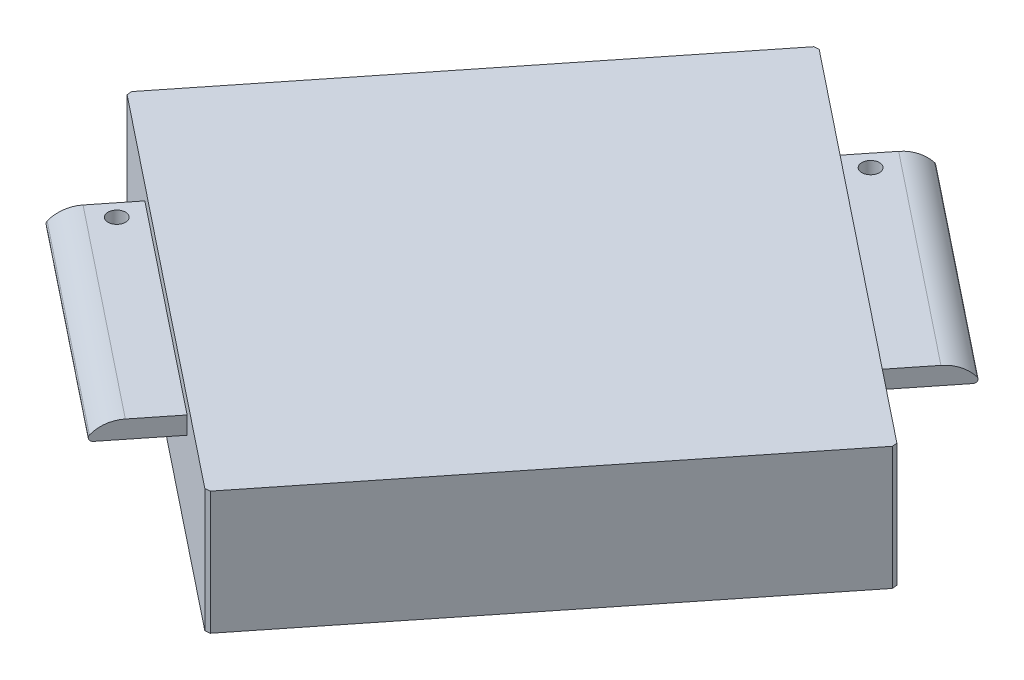
ISO-10303-21;
HEADER;
FILE_DESCRIPTION(('STEP AP214'),'2;1');
FILE_NAME('part.step','',(''),(''),'','','');
FILE_SCHEMA(('AUTOMOTIVE_DESIGN { 1 0 10303 214 1 1 1 1 }'));
ENDSEC;
DATA;
#1=APPLICATION_CONTEXT('core data for automotive mechanical design processes');
#2=APPLICATION_PROTOCOL_DEFINITION('international standard','automotive_design',2000,#1);
#3=PRODUCT_CONTEXT('',#1,'mechanical');
#4=PRODUCT('Part','Part','',(#3));
#5=PRODUCT_RELATED_PRODUCT_CATEGORY('part','',(#4));
#6=PRODUCT_DEFINITION_FORMATION('','',#4);
#7=PRODUCT_DEFINITION_CONTEXT('part definition',#1,'design');
#8=PRODUCT_DEFINITION('design','',#6,#7);
#9=PRODUCT_DEFINITION_SHAPE('','',#8);
#10=(LENGTH_UNIT() NAMED_UNIT(*) SI_UNIT(.MILLI.,.METRE.));
#11=(NAMED_UNIT(*) PLANE_ANGLE_UNIT() SI_UNIT($,.RADIAN.));
#12=(NAMED_UNIT(*) SI_UNIT($,.STERADIAN.) SOLID_ANGLE_UNIT());
#13=UNCERTAINTY_MEASURE_WITH_UNIT(LENGTH_MEASURE(1.E-05),#10,'distance_accuracy_value','');
#14=(GEOMETRIC_REPRESENTATION_CONTEXT(3) GLOBAL_UNCERTAINTY_ASSIGNED_CONTEXT((#13)) GLOBAL_UNIT_ASSIGNED_CONTEXT((#10,
#11,#12)) REPRESENTATION_CONTEXT('',''));
#15=CARTESIAN_POINT('',(0.,0.,0.));
#16=DIRECTION('',(0.,0.,1.));
#17=DIRECTION('',(1.,0.,0.));
#18=AXIS2_PLACEMENT_3D('',#15,#16,#17);
#19=CARTESIAN_POINT('',(370.197746484565,940.,-1308.88992049536));
#20=DIRECTION('',(0.62251463663762,0.,-0.782608156852414));
#21=DIRECTION('',(-0.782608156852414,0.,-0.62251463663762));
#22=AXIS2_PLACEMENT_3D('',#19,#20,#21);
#23=PLANE('',#22);
#24=DIRECTION('',(0.782608156852414,0.,0.62251463663762));
#25=VECTOR('',#24,1.);
#26=CARTESIAN_POINT('',(370.197746484565,870.,-1308.88992049536));
#27=LINE('',#26,#25);
#28=CARTESIAN_POINT('',(370.197746484565,870.,-1308.88992049536));
#29=VERTEX_POINT('',#28);
#30=CARTESIAN_POINT('',(586.197597775831,870.,-1137.07588078337));
#31=VERTEX_POINT('',#30);
#32=EDGE_CURVE('E235',#29,#31,#27,.T.);
#33=ORIENTED_EDGE('',*,*,#32,.F.);
#34=DIRECTION('',(0.,-1.,0.));
#35=VECTOR('',#34,1.);
#36=CARTESIAN_POINT('',(370.197746484565,940.,-1308.88992049536));
#37=LINE('',#36,#35);
#38=CARTESIAN_POINT('',(370.197746484565,940.,-1308.88992049536));
#39=VERTEX_POINT('',#38);
#40=EDGE_CURVE('E11',#39,#29,#37,.T.);
#41=ORIENTED_EDGE('',*,*,#40,.F.);
#42=DIRECTION('',(0.782608156852414,0.,0.62251463663762));
#43=VECTOR('',#42,1.);
#44=CARTESIAN_POINT('',(370.197746484565,940.,-1308.88992049536));
#45=LINE('',#44,#43);
#46=CARTESIAN_POINT('',(586.197597775831,940.,-1137.07588078337));
#47=VERTEX_POINT('',#46);
#48=EDGE_CURVE('E259',#39,#47,#45,.T.);
#49=ORIENTED_EDGE('',*,*,#48,.T.);
#50=DIRECTION('',(0.,-1.,0.));
#51=VECTOR('',#50,1.);
#52=CARTESIAN_POINT('',(586.197597775831,940.,-1137.07588078337));
#53=LINE('',#52,#51);
#54=EDGE_CURVE('E25',#47,#31,#53,.T.);
#55=ORIENTED_EDGE('',*,*,#54,.T.);
#56=EDGE_LOOP('',(#33,#41,#49,#55));
#57=FACE_BOUND('',#56,.T.);
#58=DIRECTION('',(0.782608156852414,0.,0.62251463663762));
#59=VECTOR('',#58,1.);
#60=CARTESIAN_POINT('',(419.502060366267,932.,-1269.67149838719));
#61=LINE('',#60,#59);
#62=CARTESIAN_POINT('',(419.502060366267,932.,-1269.67149838719));
#63=VERTEX_POINT('',#62);
#64=CARTESIAN_POINT('',(536.893283894128,932.,-1176.29430289154));
#65=VERTEX_POINT('',#64);
#66=EDGE_CURVE('E32',#63,#65,#61,.T.);
#67=ORIENTED_EDGE('',*,*,#66,.F.);
#68=DIRECTION('',(0.,-1.,0.));
#69=VECTOR('',#68,1.);
#70=CARTESIAN_POINT('',(419.502060366267,932.,-1269.67149838719));
#71=LINE('',#70,#69);
#72=CARTESIAN_POINT('',(419.502060366267,922.,-1269.67149838719));
#73=VERTEX_POINT('',#72);
#74=EDGE_CURVE('E36',#63,#73,#71,.T.);
#75=ORIENTED_EDGE('',*,*,#74,.T.);
#76=DIRECTION('',(0.782608156852414,0.,0.62251463663762));
#77=VECTOR('',#76,1.);
#78=CARTESIAN_POINT('',(419.502060366267,922.,-1269.67149838719));
#79=LINE('',#78,#77);
#80=CARTESIAN_POINT('',(536.893283894128,922.,-1176.29430289154));
#81=VERTEX_POINT('',#80);
#82=EDGE_CURVE('E136',#73,#81,#79,.T.);
#83=ORIENTED_EDGE('',*,*,#82,.T.);
#84=DIRECTION('',(0.,-1.,0.));
#85=VECTOR('',#84,1.);
#86=CARTESIAN_POINT('',(536.893283894128,932.,-1176.29430289154));
#87=LINE('',#86,#85);
#88=EDGE_CURVE('E139',#65,#81,#87,.T.);
#89=ORIENTED_EDGE('',*,*,#88,.F.);
#90=EDGE_LOOP('',(#67,#75,#83,#89));
#91=FACE_BOUND('',#90,.T.);
#92=ADVANCED_FACE('F17',(#57,#91),#23,.T.);
#93=CARTESIAN_POINT('',(367.387500897584,940.,-1308.56973345493));
#94=DIRECTION('',(-0.113203213767907,0.,-0.993571855676588));
#95=DIRECTION('',(-0.993571855676588,0.,0.113203213767907));
#96=AXIS2_PLACEMENT_3D('',#93,#94,#95);
#97=PLANE('',#96);
#98=DIRECTION('',(0.993571855676588,0.,-0.113203213767907));
#99=VECTOR('',#98,1.);
#100=CARTESIAN_POINT('',(367.387500897584,870.,-1308.56973345493));
#101=LINE('',#100,#99);
#102=CARTESIAN_POINT('',(367.387500897584,870.,-1308.56973345493));
#103=VERTEX_POINT('',#102);
#104=EDGE_CURVE('E232',#103,#29,#101,.T.);
#105=ORIENTED_EDGE('',*,*,#104,.F.);
#106=DIRECTION('',(0.,-1.,0.));
#107=VECTOR('',#106,1.);
#108=CARTESIAN_POINT('',(367.387500897584,940.,-1308.56973345493));
#109=LINE('',#108,#107);
#110=CARTESIAN_POINT('',(367.387500897584,940.,-1308.56973345493));
#111=VERTEX_POINT('',#110);
#112=EDGE_CURVE('E280',#111,#103,#109,.T.);
#113=ORIENTED_EDGE('',*,*,#112,.F.);
#114=DIRECTION('',(0.993571855676588,0.,-0.113203213767907));
#115=VECTOR('',#114,1.);
#116=CARTESIAN_POINT('',(367.387500897584,940.,-1308.56973345493));
#117=LINE('',#116,#115);
#118=EDGE_CURVE('E256',#111,#39,#117,.T.);
#119=ORIENTED_EDGE('',*,*,#118,.T.);
#120=ORIENTED_EDGE('',*,*,#40,.T.);
#121=EDGE_LOOP('',(#105,#113,#119,#120));
#122=FACE_BOUND('',#121,.T.);
#123=ADVANCED_FACE('F19',(#122),#97,.T.);
#124=CARTESIAN_POINT('',(586.197597775831,940.,-1137.07588078337));
#125=DIRECTION('',(0.993571855676588,0.,-0.113203213767907));
#126=DIRECTION('',(-0.113203213767907,0.,-0.993571855676588));
#127=AXIS2_PLACEMENT_3D('',#124,#125,#126);
#128=PLANE('',#127);
#129=DIRECTION('',(0.113203213767907,0.,0.993571855676587));
#130=VECTOR('',#129,1.);
#131=CARTESIAN_POINT('',(586.197597775831,870.,-1137.07588078337));
#132=LINE('',#131,#130);
#133=CARTESIAN_POINT('',(586.51778481626,870.,-1134.26563519639));
#134=VERTEX_POINT('',#133);
#135=EDGE_CURVE('E238',#31,#134,#132,.T.);
#136=ORIENTED_EDGE('',*,*,#135,.F.);
#137=ORIENTED_EDGE('',*,*,#54,.F.);
#138=DIRECTION('',(0.113203213767907,0.,0.993571855676587));
#139=VECTOR('',#138,1.);
#140=CARTESIAN_POINT('',(586.197597775831,940.,-1137.07588078337));
#141=LINE('',#140,#139);
#142=CARTESIAN_POINT('',(586.51778481626,940.,-1134.26563519639));
#143=VERTEX_POINT('',#142);
#144=EDGE_CURVE('E262',#47,#143,#141,.T.);
#145=ORIENTED_EDGE('',*,*,#144,.T.);
#146=DIRECTION('',(0.,-1.,0.));
#147=VECTOR('',#146,1.);
#148=CARTESIAN_POINT('',(586.51778481626,940.,-1134.26563519639));
#149=LINE('',#148,#147);
#150=EDGE_CURVE('E292',#143,#134,#149,.T.);
#151=ORIENTED_EDGE('',*,*,#150,.T.);
#152=EDGE_LOOP('',(#136,#137,#145,#151));
#153=FACE_BOUND('',#152,.T.);
#154=ADVANCED_FACE('F299',(#153),#128,.T.);
#155=CARTESIAN_POINT('',(586.51778481626,940.,-1134.26563519639));
#156=DIRECTION('',(0.782608156852414,0.,0.62251463663762));
#157=DIRECTION('',(0.62251463663762,0.,-0.782608156852414));
#158=AXIS2_PLACEMENT_3D('',#155,#156,#157);
#159=PLANE('',#158);
#160=DIRECTION('',(-0.62251463663762,0.,0.782608156852414));
#161=VECTOR('',#160,1.);
#162=CARTESIAN_POINT('',(586.51778481626,870.,-1134.26563519639));
#163=LINE('',#162,#161);
#164=CARTESIAN_POINT('',(414.703745104277,870.,-918.265783905128));
#165=VERTEX_POINT('',#164);
#166=EDGE_CURVE('E241',#134,#165,#163,.T.);
#167=ORIENTED_EDGE('',*,*,#166,.F.);
#168=ORIENTED_EDGE('',*,*,#150,.F.);
#169=DIRECTION('',(-0.62251463663762,0.,0.782608156852414));
#170=VECTOR('',#169,1.);
#171=CARTESIAN_POINT('',(586.51778481626,940.,-1134.26563519639));
#172=LINE('',#171,#170);
#173=CARTESIAN_POINT('',(414.703745104277,940.,-918.265783905128));
#174=VERTEX_POINT('',#173);
#175=EDGE_CURVE('E265',#143,#174,#172,.T.);
#176=ORIENTED_EDGE('',*,*,#175,.T.);
#177=DIRECTION('',(0.,-1.,0.));
#178=VECTOR('',#177,1.);
#179=CARTESIAN_POINT('',(414.703745104277,940.,-918.265783905128));
#180=LINE('',#179,#178);
#181=EDGE_CURVE('E290',#174,#165,#180,.T.);
#182=ORIENTED_EDGE('',*,*,#181,.T.);
#183=EDGE_LOOP('',(#167,#168,#176,#182));
#184=FACE_BOUND('',#183,.T.);
#185=ADVANCED_FACE('F314',(#184),#159,.T.);
#186=CARTESIAN_POINT('',(414.703745104277,940.,-918.265783905128));
#187=DIRECTION('',(0.113203213767907,0.,0.993571855676588));
#188=DIRECTION('',(0.993571855676588,0.,-0.113203213767907));
#189=AXIS2_PLACEMENT_3D('',#186,#187,#188);
#190=PLANE('',#189);
#191=DIRECTION('',(-0.993571855676588,0.,0.113203213767907));
#192=VECTOR('',#191,1.);
#193=CARTESIAN_POINT('',(414.703745104277,870.,-918.265783905128));
#194=LINE('',#193,#192);
#195=CARTESIAN_POINT('',(411.893499517297,870.,-917.945596864699));
#196=VERTEX_POINT('',#195);
#197=EDGE_CURVE('E244',#165,#196,#194,.T.);
#198=ORIENTED_EDGE('',*,*,#197,.F.);
#199=ORIENTED_EDGE('',*,*,#181,.F.);
#200=DIRECTION('',(-0.993571855676588,0.,0.113203213767907));
#201=VECTOR('',#200,1.);
#202=CARTESIAN_POINT('',(414.703745104277,940.,-918.265783905128));
#203=LINE('',#202,#201);
#204=CARTESIAN_POINT('',(411.893499517297,940.,-917.945596864699));
#205=VERTEX_POINT('',#204);
#206=EDGE_CURVE('E268',#174,#205,#203,.T.);
#207=ORIENTED_EDGE('',*,*,#206,.T.);
#208=DIRECTION('',(0.,-1.,0.));
#209=VECTOR('',#208,1.);
#210=CARTESIAN_POINT('',(411.893499517297,940.,-917.945596864699));
#211=LINE('',#210,#209);
#212=EDGE_CURVE('E288',#205,#196,#211,.T.);
#213=ORIENTED_EDGE('',*,*,#212,.T.);
#214=EDGE_LOOP('',(#198,#199,#207,#213));
#215=FACE_BOUND('',#214,.T.);
#216=ADVANCED_FACE('F318',(#215),#190,.T.);
#217=CARTESIAN_POINT('',(411.893499517297,940.,-917.945596864699));
#218=DIRECTION('',(-0.62251463663762,0.,0.782608156852414));
#219=DIRECTION('',(0.782608156852414,0.,0.62251463663762));
#220=AXIS2_PLACEMENT_3D('',#217,#218,#219);
#221=PLANE('',#220);
#222=DIRECTION('',(0.,-1.,0.));
#223=VECTOR('',#222,1.);
#224=CARTESIAN_POINT('',(245.197962107733,932.,-1050.54121446851));
#225=LINE('',#224,#223);
#226=CARTESIAN_POINT('',(245.197962107733,932.,-1050.54121446851));
#227=VERTEX_POINT('',#226);
#228=CARTESIAN_POINT('',(245.197962107733,922.,-1050.54121446851));
#229=VERTEX_POINT('',#228);
#230=EDGE_CURVE('E205',#227,#229,#225,.T.);
#231=ORIENTED_EDGE('',*,*,#230,.F.);
#232=DIRECTION('',(0.782608156852414,0.,0.62251463663762));
#233=VECTOR('',#232,1.);
#234=CARTESIAN_POINT('',(245.197962107733,932.,-1050.54121446851));
#235=LINE('',#234,#233);
#236=CARTESIAN_POINT('',(362.589185635595,932.,-957.164018972869));
#237=VERTEX_POINT('',#236);
#238=EDGE_CURVE('E230',#227,#237,#235,.T.);
#239=ORIENTED_EDGE('',*,*,#238,.T.);
#240=DIRECTION('',(0.,-1.,0.));
#241=VECTOR('',#240,1.);
#242=CARTESIAN_POINT('',(362.589185635595,932.,-957.164018972869));
#243=LINE('',#242,#241);
#244=CARTESIAN_POINT('',(362.589185635595,922.,-957.164018972869));
#245=VERTEX_POINT('',#244);
#246=EDGE_CURVE('E191',#237,#245,#243,.T.);
#247=ORIENTED_EDGE('',*,*,#246,.T.);
#248=DIRECTION('',(0.782608156852414,0.,0.62251463663762));
#249=VECTOR('',#248,1.);
#250=CARTESIAN_POINT('',(245.197962107733,922.,-1050.54121446851));
#251=LINE('',#250,#249);
#252=EDGE_CURVE('E227',#229,#245,#251,.T.);
#253=ORIENTED_EDGE('',*,*,#252,.F.);
#254=EDGE_LOOP('',(#231,#239,#247,#253));
#255=FACE_BOUND('',#254,.T.);
#256=DIRECTION('',(-0.782608156852414,0.,-0.62251463663762));
#257=VECTOR('',#256,1.);
#258=CARTESIAN_POINT('',(411.893499517297,870.,-917.945596864699));
#259=LINE('',#258,#257);
#260=CARTESIAN_POINT('',(195.893648226031,870.,-1089.75963657668));
#261=VERTEX_POINT('',#260);
#262=EDGE_CURVE('E247',#196,#261,#259,.T.);
#263=ORIENTED_EDGE('',*,*,#262,.F.);
#264=ORIENTED_EDGE('',*,*,#212,.F.);
#265=DIRECTION('',(-0.782608156852414,0.,-0.62251463663762));
#266=VECTOR('',#265,1.);
#267=CARTESIAN_POINT('',(411.893499517297,940.,-917.945596864699));
#268=LINE('',#267,#266);
#269=CARTESIAN_POINT('',(195.893648226031,940.,-1089.75963657668));
#270=VERTEX_POINT('',#269);
#271=EDGE_CURVE('E271',#205,#270,#268,.T.);
#272=ORIENTED_EDGE('',*,*,#271,.T.);
#273=DIRECTION('',(0.,-1.,0.));
#274=VECTOR('',#273,1.);
#275=CARTESIAN_POINT('',(195.893648226031,940.,-1089.75963657668));
#276=LINE('',#275,#274);
#277=EDGE_CURVE('E286',#270,#261,#276,.T.);
#278=ORIENTED_EDGE('',*,*,#277,.T.);
#279=EDGE_LOOP('',(#263,#264,#272,#278));
#280=FACE_BOUND('',#279,.T.);
#281=ADVANCED_FACE('F320',(#255,#280),#221,.T.);
#282=CARTESIAN_POINT('',(195.893648226031,940.,-1089.75963657668));
#283=DIRECTION('',(-0.993571855676588,0.,0.113203213767907));
#284=DIRECTION('',(0.113203213767907,0.,0.993571855676588));
#285=AXIS2_PLACEMENT_3D('',#282,#283,#284);
#286=PLANE('',#285);
#287=DIRECTION('',(-0.113203213767907,0.,-0.993571855676588));
#288=VECTOR('',#287,1.);
#289=CARTESIAN_POINT('',(195.893648226031,870.,-1089.75963657668));
#290=LINE('',#289,#288);
#291=CARTESIAN_POINT('',(195.573461185601,870.,-1092.56988216366));
#292=VERTEX_POINT('',#291);
#293=EDGE_CURVE('E250',#261,#292,#290,.T.);
#294=ORIENTED_EDGE('',*,*,#293,.F.);
#295=ORIENTED_EDGE('',*,*,#277,.F.);
#296=DIRECTION('',(-0.113203213767907,0.,-0.993571855676588));
#297=VECTOR('',#296,1.);
#298=CARTESIAN_POINT('',(195.893648226031,940.,-1089.75963657668));
#299=LINE('',#298,#297);
#300=CARTESIAN_POINT('',(195.573461185601,940.,-1092.56988216366));
#301=VERTEX_POINT('',#300);
#302=EDGE_CURVE('E274',#270,#301,#299,.T.);
#303=ORIENTED_EDGE('',*,*,#302,.T.);
#304=DIRECTION('',(0.,-1.,0.));
#305=VECTOR('',#304,1.);
#306=CARTESIAN_POINT('',(195.573461185601,940.,-1092.56988216366));
#307=LINE('',#306,#305);
#308=EDGE_CURVE('E284',#301,#292,#307,.T.);
#309=ORIENTED_EDGE('',*,*,#308,.T.);
#310=EDGE_LOOP('',(#294,#295,#303,#309));
#311=FACE_BOUND('',#310,.T.);
#312=ADVANCED_FACE('F324',(#311),#286,.T.);
#313=CARTESIAN_POINT('',(195.573461185601,940.,-1092.56988216366));
#314=DIRECTION('',(-0.782608156852414,0.,-0.62251463663762));
#315=DIRECTION('',(-0.62251463663762,0.,0.782608156852414));
#316=AXIS2_PLACEMENT_3D('',#313,#314,#315);
#317=PLANE('',#316);
#318=DIRECTION('',(0.62251463663762,0.,-0.782608156852414));
#319=VECTOR('',#318,1.);
#320=CARTESIAN_POINT('',(195.573461185601,870.,-1092.56988216366));
#321=LINE('',#320,#319);
#322=EDGE_CURVE('E253',#292,#103,#321,.T.);
#323=ORIENTED_EDGE('',*,*,#322,.F.);
#324=ORIENTED_EDGE('',*,*,#308,.F.);
#325=DIRECTION('',(0.62251463663762,0.,-0.782608156852414));
#326=VECTOR('',#325,1.);
#327=CARTESIAN_POINT('',(195.573461185601,940.,-1092.56988216366));
#328=LINE('',#327,#326);
#329=EDGE_CURVE('E277',#301,#111,#328,.T.);
#330=ORIENTED_EDGE('',*,*,#329,.T.);
#331=ORIENTED_EDGE('',*,*,#112,.T.);
#332=EDGE_LOOP('',(#323,#324,#330,#331));
#333=FACE_BOUND('',#332,.T.);
#334=ADVANCED_FACE('F326',(#333),#317,.T.);
#335=CARTESIAN_POINT('',(564.104691986189,940.,-1330.982826285));
#336=DIRECTION('',(0.,-1.,0.));
#337=DIRECTION('',(0.62251463663762,0.,-0.782608156852414));
#338=AXIS2_PLACEMENT_3D('',#335,#336,#337);
#339=PLANE('',#338);
#340=ORIENTED_EDGE('',*,*,#118,.F.);
#341=ORIENTED_EDGE('',*,*,#329,.F.);
#342=ORIENTED_EDGE('',*,*,#302,.F.);
#343=ORIENTED_EDGE('',*,*,#271,.F.);
#344=ORIENTED_EDGE('',*,*,#206,.F.);
#345=ORIENTED_EDGE('',*,*,#175,.F.);
#346=ORIENTED_EDGE('',*,*,#144,.F.);
#347=ORIENTED_EDGE('',*,*,#48,.F.);
#348=EDGE_LOOP('',(#340,#341,#342,#343,#344,#345,#346,#347));
#349=FACE_BOUND('',#348,.T.);
#350=ADVANCED_FACE('F308',(#349),#339,.F.);
#351=CARTESIAN_POINT('',(564.104691986189,870.,-1330.982826285));
#352=DIRECTION('',(0.,-1.,0.));
#353=DIRECTION('',(0.62251463663762,0.,-0.782608156852414));
#354=AXIS2_PLACEMENT_3D('',#351,#352,#353);
#355=PLANE('',#354);
#356=ORIENTED_EDGE('',*,*,#104,.T.);
#357=ORIENTED_EDGE('',*,*,#32,.T.);
#358=ORIENTED_EDGE('',*,*,#135,.T.);
#359=ORIENTED_EDGE('',*,*,#166,.T.);
#360=ORIENTED_EDGE('',*,*,#197,.T.);
#361=ORIENTED_EDGE('',*,*,#262,.T.);
#362=ORIENTED_EDGE('',*,*,#293,.T.);
#363=ORIENTED_EDGE('',*,*,#322,.T.);
#364=EDGE_LOOP('',(#356,#357,#358,#359,#360,#361,#362,#363));
#365=FACE_BOUND('',#364,.T.);
#366=ADVANCED_FACE('F302',(#365),#355,.T.);
#367=CARTESIAN_POINT('',(229.635096191794,932.,-1030.9760105472));
#368=DIRECTION('',(0.,1.,0.));
#369=DIRECTION('',(-0.62251463663762,0.,0.782608156852414));
#370=AXIS2_PLACEMENT_3D('',#367,#368,#369);
#371=PLANE('',#370);
#372=CARTESIAN_POINT('',(245.242610718287,932.,-1034.53346614148));
#373=DIRECTION('',(0.,1.,0.));
#374=DIRECTION('',(-0.62251463663762,0.,0.782608156852414));
#375=AXIS2_PLACEMENT_3D('',#372,#373,#374);
#376=CIRCLE('',#375,5.);
#377=CARTESIAN_POINT('',(242.130037535099,932.,-1030.62042535722));
#378=VERTEX_POINT('',#377);
#379=EDGE_CURVE('E185',#378,#378,#376,.T.);
#380=ORIENTED_EDGE('',*,*,#379,.F.);
#381=EDGE_LOOP('',(#380));
#382=FACE_BOUND('',#381,.T.);
#383=DIRECTION('',(0.62251463663762,0.,-0.782608156852414));
#384=VECTOR('',#383,1.);
#385=CARTESIAN_POINT('',(347.026319719656,932.,-937.59881505156));
#386=LINE('',#385,#384);
#387=CARTESIAN_POINT('',(347.026319719656,932.,-937.59881505156));
#388=VERTEX_POINT('',#387);
#389=EDGE_CURVE('E194',#388,#237,#386,.T.);
#390=ORIENTED_EDGE('',*,*,#389,.T.);
#391=ORIENTED_EDGE('',*,*,#238,.F.);
#392=DIRECTION('',(0.62251463663762,0.,-0.782608156852414));
#393=VECTOR('',#392,1.);
#394=CARTESIAN_POINT('',(229.635096191794,932.,-1030.9760105472));
#395=LINE('',#394,#393);
#396=CARTESIAN_POINT('',(229.635096191794,932.,-1030.9760105472));
#397=VERTEX_POINT('',#396);
#398=EDGE_CURVE('E202',#397,#227,#395,.T.);
#399=ORIENTED_EDGE('',*,*,#398,.F.);
#400=DIRECTION('',(0.782608156852414,0.,0.62251463663762));
#401=VECTOR('',#400,1.);
#402=CARTESIAN_POINT('',(229.635096191794,932.,-1030.9760105472));
#403=LINE('',#402,#401);
#404=EDGE_CURVE('E216',#397,#388,#403,.T.);
#405=ORIENTED_EDGE('',*,*,#404,.T.);
#406=EDGE_LOOP('',(#390,#391,#399,#405));
#407=FACE_BOUND('',#406,.T.);
#408=ADVANCED_FACE('F359',(#382,#407),#371,.T.);
#409=CARTESIAN_POINT('',(245.197962107733,922.,-1050.54121446851));
#410=DIRECTION('',(0.,-1.,0.));
#411=DIRECTION('',(0.62251463663762,0.,-0.782608156852414));
#412=AXIS2_PLACEMENT_3D('',#409,#410,#411);
#413=PLANE('',#412);
#414=CARTESIAN_POINT('',(245.242610718287,922.,-1034.53346614148));
#415=DIRECTION('',(0.,1.,0.));
#416=DIRECTION('',(0.62251463663762,0.,-0.782608156852414));
#417=AXIS2_PLACEMENT_3D('',#414,#415,#416);
#418=CIRCLE('',#417,5.);
#419=CARTESIAN_POINT('',(248.355183901475,922.,-1038.44650692574));
#420=VERTEX_POINT('',#419);
#421=EDGE_CURVE('E190',#420,#420,#418,.T.);
#422=ORIENTED_EDGE('',*,*,#421,.T.);
#423=EDGE_LOOP('',(#422));
#424=FACE_BOUND('',#423,.T.);
#425=DIRECTION('',(-0.62251463663762,0.,0.782608156852414));
#426=VECTOR('',#425,1.);
#427=CARTESIAN_POINT('',(362.589185635595,922.,-957.164018972869));
#428=LINE('',#427,#426);
#429=CARTESIAN_POINT('',(338.933629443366,922.,-927.424909012477));
#430=VERTEX_POINT('',#429);
#431=EDGE_CURVE('E193',#245,#430,#428,.T.);
#432=ORIENTED_EDGE('',*,*,#431,.T.);
#433=DIRECTION('',(0.782608156852414,0.,0.62251463663762));
#434=VECTOR('',#433,1.);
#435=CARTESIAN_POINT('',(221.542405915504,922.,-1020.80210450812));
#436=LINE('',#435,#434);
#437=CARTESIAN_POINT('',(221.542405915504,922.,-1020.80210450812));
#438=VERTEX_POINT('',#437);
#439=EDGE_CURVE('E224',#438,#430,#436,.T.);
#440=ORIENTED_EDGE('',*,*,#439,.F.);
#441=DIRECTION('',(-0.62251463663762,0.,0.782608156852414));
#442=VECTOR('',#441,1.);
#443=CARTESIAN_POINT('',(245.197962107733,922.,-1050.54121446851));
#444=LINE('',#443,#442);
#445=EDGE_CURVE('E208',#229,#438,#444,.T.);
#446=ORIENTED_EDGE('',*,*,#445,.F.);
#447=ORIENTED_EDGE('',*,*,#252,.T.);
#448=EDGE_LOOP('',(#432,#440,#446,#447));
#449=FACE_BOUND('',#448,.T.);
#450=ADVANCED_FACE('F366',(#424,#449),#413,.T.);
#451=CARTESIAN_POINT('',(221.542405915504,924.,-1020.80210450812));
#452=DIRECTION('',(0.782608156852414,0.,0.62251463663762));
#453=DIRECTION('',(0.62251463663762,0.,-0.782608156852414));
#454=AXIS2_PLACEMENT_3D('',#451,#452,#453);
#455=CYLINDRICAL_SURFACE('',#454,2.);
#456=CARTESIAN_POINT('',(338.933629443366,924.,-927.424909012477));
#457=DIRECTION('',(-0.782608156852414,0.,-0.62251463663762));
#458=DIRECTION('',(0.,-1.,0.));
#459=AXIS2_PLACEMENT_3D('',#456,#457,#458);
#460=CIRCLE('',#459,2.);
#461=CARTESIAN_POINT('',(337.984366799365,925.294113061495,-926.231522312042));
#462=VERTEX_POINT('',#461);
#463=EDGE_CURVE('E197',#430,#462,#460,.T.);
#464=ORIENTED_EDGE('',*,*,#463,.T.);
#465=DIRECTION('',(0.782608156852414,0.,0.62251463663762));
#466=VECTOR('',#465,1.);
#467=CARTESIAN_POINT('',(220.593143271504,925.294113061495,-1019.60871780768));
#468=LINE('',#467,#466);
#469=CARTESIAN_POINT('',(220.593143271504,925.294113061495,-1019.60871780768));
#470=VERTEX_POINT('',#469);
#471=EDGE_CURVE('E221',#470,#462,#468,.T.);
#472=ORIENTED_EDGE('',*,*,#471,.F.);
#473=CARTESIAN_POINT('',(221.542405915504,924.,-1020.80210450812));
#474=DIRECTION('',(-0.782608156852414,0.,-0.62251463663762));
#475=DIRECTION('',(0.,-1.,0.));
#476=AXIS2_PLACEMENT_3D('',#473,#474,#475);
#477=CIRCLE('',#476,2.);
#478=EDGE_CURVE('E211',#438,#470,#477,.T.);
#479=ORIENTED_EDGE('',*,*,#478,.F.);
#480=ORIENTED_EDGE('',*,*,#439,.T.);
#481=EDGE_LOOP('',(#464,#472,#479,#480));
#482=FACE_BOUND('',#481,.T.);
#483=ADVANCED_FACE('F369',(#482),#455,.T.);
#484=CARTESIAN_POINT('',(229.6111383895,913.000038977292,-1030.94589146182));
#485=DIRECTION('',(0.782608156852414,0.,0.62251463663762));
#486=DIRECTION('',(0.62251463663762,0.,-0.782608156852414));
#487=AXIS2_PLACEMENT_3D('',#484,#485,#486);
#488=CYLINDRICAL_SURFACE('',#487,19.);
#489=CARTESIAN_POINT('',(347.002361917362,913.000038977292,-937.568695966174));
#490=DIRECTION('',(-0.782608156852414,0.,-0.62251463663762));
#491=DIRECTION('',(0.00126093696275025,0.999997948563554,-0.00158521502025485));
#492=AXIS2_PLACEMENT_3D('',#489,#490,#491);
#493=CIRCLE('',#492,19.);
#494=EDGE_CURVE('E200',#462,#388,#493,.T.);
#495=ORIENTED_EDGE('',*,*,#494,.T.);
#496=ORIENTED_EDGE('',*,*,#404,.F.);
#497=CARTESIAN_POINT('',(229.6111383895,913.000038977292,-1030.94589146182));
#498=DIRECTION('',(-0.782608156852414,0.,-0.62251463663762));
#499=DIRECTION('',(0.00126093696275025,0.999997948563554,-0.00158521502025485));
#500=AXIS2_PLACEMENT_3D('',#497,#498,#499);
#501=CIRCLE('',#500,19.);
#502=EDGE_CURVE('E214',#470,#397,#501,.T.);
#503=ORIENTED_EDGE('',*,*,#502,.F.);
#504=ORIENTED_EDGE('',*,*,#471,.T.);
#505=EDGE_LOOP('',(#495,#496,#503,#504));
#506=FACE_BOUND('',#505,.T.);
#507=ADVANCED_FACE('F371',(#506),#488,.T.);
#508=CARTESIAN_POINT('',(221.542405915504,924.,-1020.80210450812));
#509=DIRECTION('',(0.782608156852414,0.,0.62251463663762));
#510=DIRECTION('',(0.62251463663762,0.,-0.782608156852414));
#511=AXIS2_PLACEMENT_3D('',#508,#509,#510);
#512=PLANE('',#511);
#513=ORIENTED_EDGE('',*,*,#398,.T.);
#514=ORIENTED_EDGE('',*,*,#230,.T.);
#515=ORIENTED_EDGE('',*,*,#445,.T.);
#516=ORIENTED_EDGE('',*,*,#478,.T.);
#517=ORIENTED_EDGE('',*,*,#502,.T.);
#518=EDGE_LOOP('',(#513,#514,#515,#516,#517));
#519=FACE_BOUND('',#518,.T.);
#520=ADVANCED_FACE('F356',(#519),#512,.F.);
#521=CARTESIAN_POINT('',(338.933629443366,924.,-927.424909012477));
#522=DIRECTION('',(0.782608156852414,0.,0.62251463663762));
#523=DIRECTION('',(0.62251463663762,0.,-0.782608156852414));
#524=AXIS2_PLACEMENT_3D('',#521,#522,#523);
#525=PLANE('',#524);
#526=ORIENTED_EDGE('',*,*,#389,.F.);
#527=ORIENTED_EDGE('',*,*,#494,.F.);
#528=ORIENTED_EDGE('',*,*,#463,.F.);
#529=ORIENTED_EDGE('',*,*,#431,.F.);
#530=ORIENTED_EDGE('',*,*,#246,.F.);
#531=EDGE_LOOP('',(#526,#527,#528,#529,#530));
#532=FACE_BOUND('',#531,.T.);
#533=ADVANCED_FACE('F362',(#532),#525,.T.);
#534=CARTESIAN_POINT('',(245.242610718287,916.999999999951,-1034.53346614148));
#535=DIRECTION('',(0.,1.,0.));
#536=DIRECTION('',(-0.62251463663762,0.,0.782608156852414));
#537=AXIS2_PLACEMENT_3D('',#534,#535,#536);
#538=CYLINDRICAL_SURFACE('',#537,5.);
#539=ORIENTED_EDGE('',*,*,#421,.F.);
#540=EDGE_LOOP('',(#539));
#541=FACE_BOUND('',#540,.T.);
#542=ORIENTED_EDGE('',*,*,#379,.T.);
#543=EDGE_LOOP('',(#542));
#544=FACE_BOUND('',#543,.T.);
#545=ADVANCED_FACE('F434',(#541,#544),#538,.F.);
#546=CARTESIAN_POINT('',(435.064926282205,932.,-1289.2367023085));
#547=DIRECTION('',(0.,1.,0.));
#548=DIRECTION('',(0.62251463663762,0.,-0.782608156852414));
#549=AXIS2_PLACEMENT_3D('',#546,#547,#548);
#550=PLANE('',#549);
#551=CARTESIAN_POINT('',(435.10957489276,932.,-1273.22895398147));
#552=DIRECTION('',(0.,-1.,0.));
#553=DIRECTION('',(0.62251463663762,0.,-0.782608156852414));
#554=AXIS2_PLACEMENT_3D('',#551,#552,#553);
#555=CIRCLE('',#554,5.);
#556=CARTESIAN_POINT('',(438.222148075949,932.,-1277.14199476573));
#557=VERTEX_POINT('',#556);
#558=EDGE_CURVE('E162',#557,#557,#555,.T.);
#559=ORIENTED_EDGE('',*,*,#558,.T.);
#560=EDGE_LOOP('',(#559));
#561=FACE_BOUND('',#560,.T.);
#562=DIRECTION('',(-0.62251463663762,0.,0.782608156852414));
#563=VECTOR('',#562,1.);
#564=CARTESIAN_POINT('',(552.456149810067,932.,-1195.85950681285));
#565=LINE('',#564,#563);
#566=CARTESIAN_POINT('',(552.456149810067,932.,-1195.85950681285));
#567=VERTEX_POINT('',#566);
#568=EDGE_CURVE('E157',#567,#65,#565,.T.);
#569=ORIENTED_EDGE('',*,*,#568,.F.);
#570=DIRECTION('',(0.782608156852414,0.,0.62251463663762));
#571=VECTOR('',#570,1.);
#572=CARTESIAN_POINT('',(435.064926282205,932.,-1289.2367023085));
#573=LINE('',#572,#571);
#574=CARTESIAN_POINT('',(435.064926282205,932.,-1289.2367023085));
#575=VERTEX_POINT('',#574);
#576=EDGE_CURVE('E177',#575,#567,#573,.T.);
#577=ORIENTED_EDGE('',*,*,#576,.F.);
#578=DIRECTION('',(-0.62251463663762,0.,0.782608156852414));
#579=VECTOR('',#578,1.);
#580=CARTESIAN_POINT('',(435.064926282205,932.,-1289.2367023085));
#581=LINE('',#580,#579);
#582=EDGE_CURVE('E166',#575,#63,#581,.T.);
#583=ORIENTED_EDGE('',*,*,#582,.T.);
#584=ORIENTED_EDGE('',*,*,#66,.T.);
#585=EDGE_LOOP('',(#569,#577,#583,#584));
#586=FACE_BOUND('',#585,.T.);
#587=ADVANCED_FACE('F442',(#561,#586),#550,.T.);
#588=CARTESIAN_POINT('',(419.502060366267,922.,-1269.67149838719));
#589=DIRECTION('',(0.,-1.,0.));
#590=DIRECTION('',(-0.62251463663762,0.,0.782608156852414));
#591=AXIS2_PLACEMENT_3D('',#588,#589,#590);
#592=PLANE('',#591);
#593=CARTESIAN_POINT('',(435.10957489276,922.,-1273.22895398147));
#594=DIRECTION('',(0.,-1.,0.));
#595=DIRECTION('',(-0.62251463663762,0.,0.782608156852414));
#596=AXIS2_PLACEMENT_3D('',#593,#594,#595);
#597=CIRCLE('',#596,5.);
#598=CARTESIAN_POINT('',(431.997001709572,922.,-1269.3159131972));
#599=VERTEX_POINT('',#598);
#600=EDGE_CURVE('E159',#599,#599,#597,.T.);
#601=ORIENTED_EDGE('',*,*,#600,.F.);
#602=EDGE_LOOP('',(#601));
#603=FACE_BOUND('',#602,.T.);
#604=DIRECTION('',(0.62251463663762,0.,-0.782608156852414));
#605=VECTOR('',#604,1.);
#606=CARTESIAN_POINT('',(536.893283894128,922.,-1176.29430289154));
#607=LINE('',#606,#605);
#608=CARTESIAN_POINT('',(560.548840086358,922.,-1206.03341285194));
#609=VERTEX_POINT('',#608);
#610=EDGE_CURVE('E146',#81,#609,#607,.T.);
#611=ORIENTED_EDGE('',*,*,#610,.F.);
#612=ORIENTED_EDGE('',*,*,#82,.F.);
#613=DIRECTION('',(0.62251463663762,0.,-0.782608156852414));
#614=VECTOR('',#613,1.);
#615=CARTESIAN_POINT('',(419.502060366267,922.,-1269.67149838719));
#616=LINE('',#615,#614);
#617=CARTESIAN_POINT('',(443.157616558496,922.,-1299.41060834758));
#618=VERTEX_POINT('',#617);
#619=EDGE_CURVE('E169',#73,#618,#616,.T.);
#620=ORIENTED_EDGE('',*,*,#619,.T.);
#621=DIRECTION('',(0.782608156852414,0.,0.62251463663762));
#622=VECTOR('',#621,1.);
#623=CARTESIAN_POINT('',(443.157616558496,922.,-1299.41060834758));
#624=LINE('',#623,#622);
#625=EDGE_CURVE('E143',#618,#609,#624,.T.);
#626=ORIENTED_EDGE('',*,*,#625,.T.);
#627=EDGE_LOOP('',(#611,#612,#620,#626));
#628=FACE_BOUND('',#627,.T.);
#629=ADVANCED_FACE('F147',(#603,#628),#592,.T.);
#630=CARTESIAN_POINT('',(443.157616558496,924.,-1299.41060834758));
#631=DIRECTION('',(0.782608156852414,0.,0.62251463663762));
#632=DIRECTION('',(-0.62251463663762,0.,0.782608156852414));
#633=AXIS2_PLACEMENT_3D('',#630,#631,#632);
#634=CYLINDRICAL_SURFACE('',#633,2.);
#635=CARTESIAN_POINT('',(560.548840086358,924.,-1206.03341285194));
#636=DIRECTION('',(0.782608156852414,0.,0.62251463663762));
#637=DIRECTION('',(0.,-1.,0.));
#638=AXIS2_PLACEMENT_3D('',#635,#636,#637);
#639=CIRCLE('',#638,2.);
#640=CARTESIAN_POINT('',(561.498102730358,925.294113061495,-1207.22679955237));
#641=VERTEX_POINT('',#640);
#642=EDGE_CURVE('E151',#609,#641,#639,.T.);
#643=ORIENTED_EDGE('',*,*,#642,.F.);
#644=ORIENTED_EDGE('',*,*,#625,.F.);
#645=CARTESIAN_POINT('',(443.157616558496,924.,-1299.41060834758));
#646=DIRECTION('',(0.782608156852414,0.,0.62251463663762));
#647=DIRECTION('',(0.,-1.,0.));
#648=AXIS2_PLACEMENT_3D('',#645,#646,#647);
#649=CIRCLE('',#648,2.);
#650=CARTESIAN_POINT('',(444.106879202496,925.294113061495,-1300.60399504801));
#651=VERTEX_POINT('',#650);
#652=EDGE_CURVE('E171',#618,#651,#649,.T.);
#653=ORIENTED_EDGE('',*,*,#652,.T.);
#654=DIRECTION('',(0.782608156852414,0.,0.62251463663762));
#655=VECTOR('',#654,1.);
#656=CARTESIAN_POINT('',(444.106879202496,925.294113061495,-1300.60399504801));
#657=LINE('',#656,#655);
#658=EDGE_CURVE('E181',#651,#641,#657,.T.);
#659=ORIENTED_EDGE('',*,*,#658,.T.);
#660=EDGE_LOOP('',(#643,#644,#653,#659));
#661=FACE_BOUND('',#660,.T.);
#662=ADVANCED_FACE('F461',(#661),#634,.T.);
#663=CARTESIAN_POINT('',(435.088884084499,913.000038977292,-1289.26682139388));
#664=DIRECTION('',(0.782608156852414,0.,0.62251463663762));
#665=DIRECTION('',(-0.62251463663762,0.,0.782608156852414));
#666=AXIS2_PLACEMENT_3D('',#663,#664,#665);
#667=CYLINDRICAL_SURFACE('',#666,19.);
#668=CARTESIAN_POINT('',(552.480107612361,913.000038977292,-1195.88962589824));
#669=DIRECTION('',(0.782608156852415,0.,0.62251463663762));
#670=DIRECTION('',(-0.00126093696275225,0.999997948563554,0.00158521502025289));
#671=AXIS2_PLACEMENT_3D('',#668,#669,#670);
#672=CIRCLE('',#671,19.);
#673=EDGE_CURVE('E165',#641,#567,#672,.T.);
#674=ORIENTED_EDGE('',*,*,#673,.F.);
#675=ORIENTED_EDGE('',*,*,#658,.F.);
#676=CARTESIAN_POINT('',(435.088884084499,913.000038977292,-1289.26682139388));
#677=DIRECTION('',(0.782608156852415,0.,0.62251463663762));
#678=DIRECTION('',(-0.00126093696275225,0.999997948563554,0.00158521502025289));
#679=AXIS2_PLACEMENT_3D('',#676,#677,#678);
#680=CIRCLE('',#679,19.);
#681=EDGE_CURVE('E174',#651,#575,#680,.T.);
#682=ORIENTED_EDGE('',*,*,#681,.T.);
#683=ORIENTED_EDGE('',*,*,#576,.T.);
#684=EDGE_LOOP('',(#674,#675,#682,#683));
#685=FACE_BOUND('',#684,.T.);
#686=ADVANCED_FACE('F471',(#685),#667,.T.);
#687=CARTESIAN_POINT('',(443.157616558496,924.,-1299.41060834758));
#688=DIRECTION('',(0.782608156852414,0.,0.62251463663762));
#689=DIRECTION('',(-0.62251463663762,0.,0.782608156852414));
#690=AXIS2_PLACEMENT_3D('',#687,#688,#689);
#691=PLANE('',#690);
#692=ORIENTED_EDGE('',*,*,#582,.F.);
#693=ORIENTED_EDGE('',*,*,#681,.F.);
#694=ORIENTED_EDGE('',*,*,#652,.F.);
#695=ORIENTED_EDGE('',*,*,#619,.F.);
#696=ORIENTED_EDGE('',*,*,#74,.F.);
#697=EDGE_LOOP('',(#692,#693,#694,#695,#696));
#698=FACE_BOUND('',#697,.T.);
#699=ADVANCED_FACE('F481',(#698),#691,.F.);
#700=CARTESIAN_POINT('',(560.548840086358,924.,-1206.03341285194));
#701=DIRECTION('',(0.782608156852414,0.,0.62251463663762));
#702=DIRECTION('',(-0.62251463663762,0.,0.782608156852414));
#703=AXIS2_PLACEMENT_3D('',#700,#701,#702);
#704=PLANE('',#703);
#705=ORIENTED_EDGE('',*,*,#568,.T.);
#706=ORIENTED_EDGE('',*,*,#88,.T.);
#707=ORIENTED_EDGE('',*,*,#610,.T.);
#708=ORIENTED_EDGE('',*,*,#642,.T.);
#709=ORIENTED_EDGE('',*,*,#673,.T.);
#710=EDGE_LOOP('',(#705,#706,#707,#708,#709));
#711=FACE_BOUND('',#710,.T.);
#712=ADVANCED_FACE('F154',(#711),#704,.T.);
#713=CARTESIAN_POINT('',(435.10957489276,916.999999999951,-1273.22895398147));
#714=DIRECTION('',(0.,1.,0.));
#715=DIRECTION('',(0.62251463663762,0.,-0.782608156852414));
#716=AXIS2_PLACEMENT_3D('',#713,#714,#715);
#717=CYLINDRICAL_SURFACE('',#716,5.);
#718=ORIENTED_EDGE('',*,*,#600,.T.);
#719=EDGE_LOOP('',(#718));
#720=FACE_BOUND('',#719,.T.);
#721=ORIENTED_EDGE('',*,*,#558,.F.);
#722=EDGE_LOOP('',(#721));
#723=FACE_BOUND('',#722,.T.);
#724=ADVANCED_FACE('F500',(#720,#723),#717,.F.);
#725=CLOSED_SHELL('',(#92,#123,#154,#185,#216,#281,#312,#334,#350,#366,#408,#450,#483,#507,#520,
#533,#545,#587,#629,#662,#686,#699,#712,#724));
#726=MANIFOLD_SOLID_BREP('B1',#725);
#727=ADVANCED_BREP_SHAPE_REPRESENTATION('',(#18,#726),#14);
#728=SHAPE_DEFINITION_REPRESENTATION(#9,#727);
ENDSEC;
END-ISO-10303-21;
